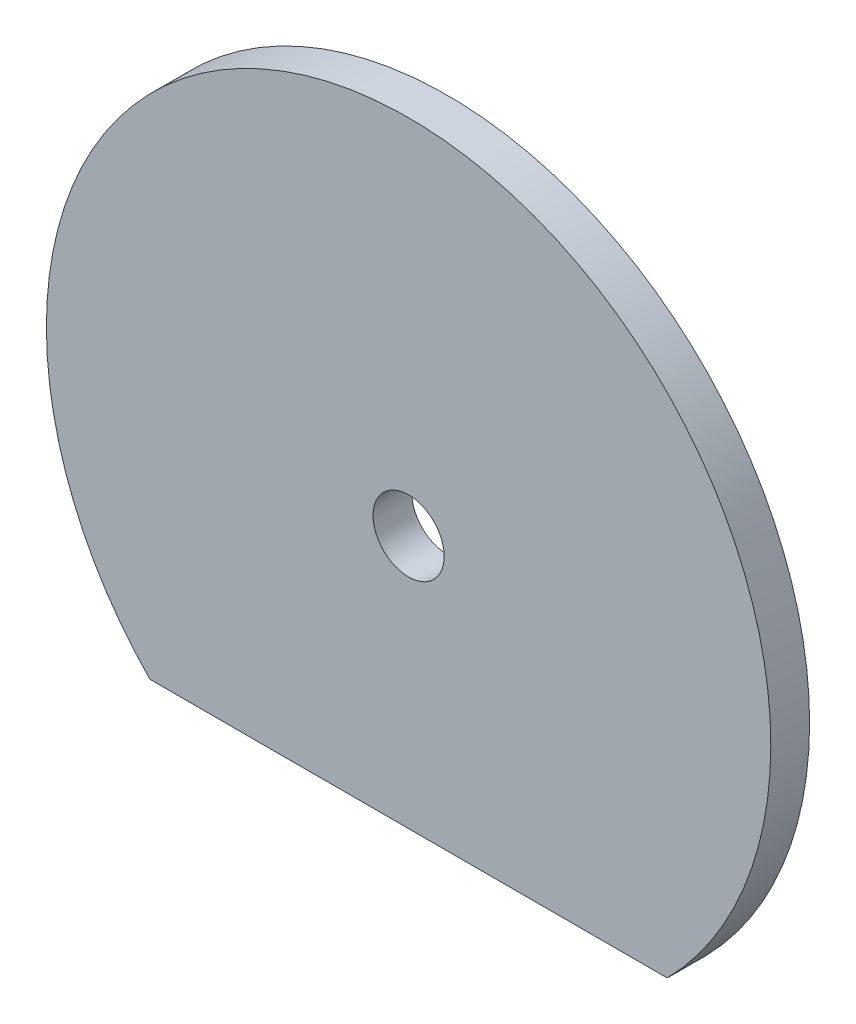
ISO-10303-21;
HEADER;
FILE_DESCRIPTION(('STEP AP214'),'2;1');
FILE_NAME('part.step','',(''),(''),'','','');
FILE_SCHEMA(('AUTOMOTIVE_DESIGN { 1 0 10303 214 1 1 1 1 }'));
ENDSEC;
DATA;
#1=APPLICATION_CONTEXT('core data for automotive mechanical design processes');
#2=APPLICATION_PROTOCOL_DEFINITION('international standard','automotive_design',2000,#1);
#3=PRODUCT_CONTEXT('',#1,'mechanical');
#4=PRODUCT('Part','Part','',(#3));
#5=PRODUCT_RELATED_PRODUCT_CATEGORY('part','',(#4));
#6=PRODUCT_DEFINITION_FORMATION('','',#4);
#7=PRODUCT_DEFINITION_CONTEXT('part definition',#1,'design');
#8=PRODUCT_DEFINITION('design','',#6,#7);
#9=PRODUCT_DEFINITION_SHAPE('','',#8);
#10=(LENGTH_UNIT() NAMED_UNIT(*) SI_UNIT(.MILLI.,.METRE.));
#11=(NAMED_UNIT(*) PLANE_ANGLE_UNIT() SI_UNIT($,.RADIAN.));
#12=(NAMED_UNIT(*) SI_UNIT($,.STERADIAN.) SOLID_ANGLE_UNIT());
#13=UNCERTAINTY_MEASURE_WITH_UNIT(LENGTH_MEASURE(1.E-05),#10,'distance_accuracy_value','');
#14=(GEOMETRIC_REPRESENTATION_CONTEXT(3) GLOBAL_UNCERTAINTY_ASSIGNED_CONTEXT((#13)) GLOBAL_UNIT_ASSIGNED_CONTEXT((#10,
#11,#12)) REPRESENTATION_CONTEXT('',''));
#15=CARTESIAN_POINT('',(0.,0.,0.));
#16=DIRECTION('',(0.,0.,1.));
#17=DIRECTION('',(1.,0.,0.));
#18=AXIS2_PLACEMENT_3D('',#15,#16,#17);
#19=CARTESIAN_POINT('',(20.,19.5959179422654,3.));
#20=DIRECTION('',(0.,0.,-1.));
#21=DIRECTION('',(-1.,0.,0.));
#22=AXIS2_PLACEMENT_3D('',#19,#20,#21);
#23=CYLINDRICAL_SURFACE('',#22,28.);
#24=CARTESIAN_POINT('',(20.,19.5959179422654,0.));
#25=DIRECTION('',(0.,0.,1.));
#26=DIRECTION('',(1.,0.,0.));
#27=AXIS2_PLACEMENT_3D('',#24,#25,#26);
#28=CIRCLE('',#27,28.);
#29=CARTESIAN_POINT('',(40.,0.,0.));
#30=VERTEX_POINT('',#29);
#31=CARTESIAN_POINT('',(0.,0.,0.));
#32=VERTEX_POINT('',#31);
#33=EDGE_CURVE('E64',#30,#32,#28,.T.);
#34=ORIENTED_EDGE('',*,*,#33,.T.);
#35=DIRECTION('',(0.,0.,-1.));
#36=VECTOR('',#35,1.);
#37=CARTESIAN_POINT('',(0.,0.,3.));
#38=LINE('',#37,#36);
#39=CARTESIAN_POINT('',(0.,0.,3.));
#40=VERTEX_POINT('',#39);
#41=EDGE_CURVE('E11',#40,#32,#38,.T.);
#42=ORIENTED_EDGE('',*,*,#41,.F.);
#43=CARTESIAN_POINT('',(20.,19.5959179422654,3.));
#44=DIRECTION('',(0.,0.,1.));
#45=DIRECTION('',(1.,0.,0.));
#46=AXIS2_PLACEMENT_3D('',#43,#44,#45);
#47=CIRCLE('',#46,28.);
#48=CARTESIAN_POINT('',(40.,0.,3.));
#49=VERTEX_POINT('',#48);
#50=EDGE_CURVE('E63',#49,#40,#47,.T.);
#51=ORIENTED_EDGE('',*,*,#50,.F.);
#52=DIRECTION('',(0.,0.,-1.));
#53=VECTOR('',#52,1.);
#54=CARTESIAN_POINT('',(40.,0.,3.));
#55=LINE('',#54,#53);
#56=EDGE_CURVE('E41',#49,#30,#55,.T.);
#57=ORIENTED_EDGE('',*,*,#56,.T.);
#58=EDGE_LOOP('',(#34,#42,#51,#57));
#59=FACE_BOUND('',#58,.T.);
#60=ADVANCED_FACE('F32',(#59),#23,.T.);
#61=CARTESIAN_POINT('',(0.,0.,3.));
#62=DIRECTION('',(0.,1.,0.));
#63=DIRECTION('',(0.,0.,1.));
#64=AXIS2_PLACEMENT_3D('',#61,#62,#63);
#65=PLANE('',#64);
#66=DIRECTION('',(1.,0.,0.));
#67=VECTOR('',#66,1.);
#68=CARTESIAN_POINT('',(0.,0.,0.));
#69=LINE('',#68,#67);
#70=EDGE_CURVE('E56',#32,#30,#69,.T.);
#71=ORIENTED_EDGE('',*,*,#70,.T.);
#72=ORIENTED_EDGE('',*,*,#56,.F.);
#73=DIRECTION('',(1.,0.,0.));
#74=VECTOR('',#73,1.);
#75=CARTESIAN_POINT('',(0.,0.,3.));
#76=LINE('',#75,#74);
#77=EDGE_CURVE('E48',#40,#49,#76,.T.);
#78=ORIENTED_EDGE('',*,*,#77,.F.);
#79=ORIENTED_EDGE('',*,*,#41,.T.);
#80=EDGE_LOOP('',(#71,#72,#78,#79));
#81=FACE_BOUND('',#80,.T.);
#82=ADVANCED_FACE('F59',(#81),#65,.F.);
#83=CARTESIAN_POINT('',(20.,19.5959179422654,3.));
#84=DIRECTION('',(0.,0.,1.));
#85=DIRECTION('',(1.,0.,0.));
#86=AXIS2_PLACEMENT_3D('',#83,#84,#85);
#87=PLANE('',#86);
#88=CARTESIAN_POINT('',(20.,19.5959179422654,3.));
#89=DIRECTION('',(0.,0.,1.));
#90=DIRECTION('',(1.,0.,0.));
#91=AXIS2_PLACEMENT_3D('',#88,#89,#90);
#92=CIRCLE('',#91,2.75);
#93=CARTESIAN_POINT('',(22.75,19.5959179422654,3.));
#94=VERTEX_POINT('',#93);
#95=EDGE_CURVE('E71',#94,#94,#92,.T.);
#96=ORIENTED_EDGE('',*,*,#95,.F.);
#97=EDGE_LOOP('',(#96));
#98=FACE_BOUND('',#97,.T.);
#99=ORIENTED_EDGE('',*,*,#50,.T.);
#100=ORIENTED_EDGE('',*,*,#77,.T.);
#101=EDGE_LOOP('',(#99,#100));
#102=FACE_BOUND('',#101,.T.);
#103=ADVANCED_FACE('F81',(#98,#102),#87,.T.);
#104=CARTESIAN_POINT('',(20.,19.5959179422654,0.));
#105=DIRECTION('',(0.,0.,1.));
#106=DIRECTION('',(1.,0.,0.));
#107=AXIS2_PLACEMENT_3D('',#104,#105,#106);
#108=PLANE('',#107);
#109=CARTESIAN_POINT('',(20.,19.5959179422654,0.));
#110=DIRECTION('',(0.,0.,1.));
#111=DIRECTION('',(1.,0.,0.));
#112=AXIS2_PLACEMENT_3D('',#109,#110,#111);
#113=CIRCLE('',#112,2.75);
#114=CARTESIAN_POINT('',(22.75,19.5959179422654,0.));
#115=VERTEX_POINT('',#114);
#116=EDGE_CURVE('E35',#115,#115,#113,.T.);
#117=ORIENTED_EDGE('',*,*,#116,.T.);
#118=EDGE_LOOP('',(#117));
#119=FACE_BOUND('',#118,.T.);
#120=ORIENTED_EDGE('',*,*,#33,.F.);
#121=ORIENTED_EDGE('',*,*,#70,.F.);
#122=EDGE_LOOP('',(#120,#121));
#123=FACE_BOUND('',#122,.T.);
#124=ADVANCED_FACE('F68',(#119,#123),#108,.F.);
#125=CARTESIAN_POINT('',(20.,19.5959179422654,-7.));
#126=DIRECTION('',(0.,0.,1.));
#127=DIRECTION('',(1.,0.,0.));
#128=AXIS2_PLACEMENT_3D('',#125,#126,#127);
#129=CYLINDRICAL_SURFACE('',#128,2.75);
#130=ORIENTED_EDGE('',*,*,#95,.T.);
#131=EDGE_LOOP('',(#130));
#132=FACE_BOUND('',#131,.T.);
#133=ORIENTED_EDGE('',*,*,#116,.F.);
#134=EDGE_LOOP('',(#133));
#135=FACE_BOUND('',#134,.T.);
#136=ADVANCED_FACE('F78',(#132,#135),#129,.F.);
#137=CLOSED_SHELL('',(#60,#82,#103,#124,#136));
#138=MANIFOLD_SOLID_BREP('B2',#137);
#139=ADVANCED_BREP_SHAPE_REPRESENTATION('',(#18,#138),#14);
#140=SHAPE_DEFINITION_REPRESENTATION(#9,#139);
ENDSEC;
END-ISO-10303-21;
